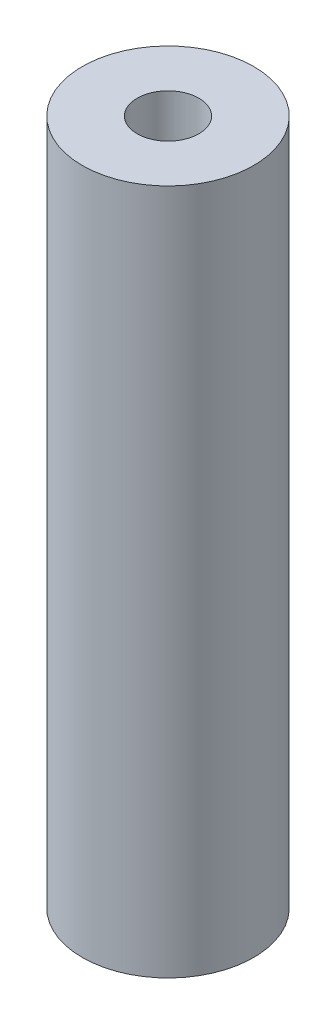
ISO-10303-21;
HEADER;
FILE_DESCRIPTION(('STEP AP214'),'2;1');
FILE_NAME('part.step','',(''),(''),'','','');
FILE_SCHEMA(('AUTOMOTIVE_DESIGN { 1 0 10303 214 1 1 1 1 }'));
ENDSEC;
DATA;
#1=APPLICATION_CONTEXT('core data for automotive mechanical design processes');
#2=APPLICATION_PROTOCOL_DEFINITION('international standard','automotive_design',2000,#1);
#3=PRODUCT_CONTEXT('',#1,'mechanical');
#4=PRODUCT('Part','Part','',(#3));
#5=PRODUCT_RELATED_PRODUCT_CATEGORY('part','',(#4));
#6=PRODUCT_DEFINITION_FORMATION('','',#4);
#7=PRODUCT_DEFINITION_CONTEXT('part definition',#1,'design');
#8=PRODUCT_DEFINITION('design','',#6,#7);
#9=PRODUCT_DEFINITION_SHAPE('','',#8);
#10=(LENGTH_UNIT() NAMED_UNIT(*) SI_UNIT(.MILLI.,.METRE.));
#11=(NAMED_UNIT(*) PLANE_ANGLE_UNIT() SI_UNIT($,.RADIAN.));
#12=(NAMED_UNIT(*) SI_UNIT($,.STERADIAN.) SOLID_ANGLE_UNIT());
#13=UNCERTAINTY_MEASURE_WITH_UNIT(LENGTH_MEASURE(1.E-05),#10,'distance_accuracy_value','');
#14=(GEOMETRIC_REPRESENTATION_CONTEXT(3) GLOBAL_UNCERTAINTY_ASSIGNED_CONTEXT((#13)) GLOBAL_UNIT_ASSIGNED_CONTEXT((#10,
#11,#12)) REPRESENTATION_CONTEXT('',''));
#15=CARTESIAN_POINT('',(0.,0.,0.));
#16=DIRECTION('',(0.,0.,1.));
#17=DIRECTION('',(1.,0.,0.));
#18=AXIS2_PLACEMENT_3D('',#15,#16,#17);
#19=CARTESIAN_POINT('',(0.,400.,0.));
#20=DIRECTION('',(0.,1.,0.));
#21=DIRECTION('',(0.,0.,1.));
#22=AXIS2_PLACEMENT_3D('',#19,#20,#21);
#23=PLANE('',#22);
#24=CARTESIAN_POINT('',(0.,400.,0.));
#25=DIRECTION('',(0.,1.,0.));
#26=DIRECTION('',(0.,0.,1.));
#27=AXIS2_PLACEMENT_3D('',#24,#25,#26);
#28=CIRCLE('',#27,50.);
#29=CARTESIAN_POINT('',(0.,400.,50.));
#30=VERTEX_POINT('',#29);
#31=EDGE_CURVE('E10',#30,#30,#28,.T.);
#32=ORIENTED_EDGE('',*,*,#31,.T.);
#33=EDGE_LOOP('',(#32));
#34=FACE_BOUND('',#33,.T.);
#35=CARTESIAN_POINT('',(0.,400.,0.));
#36=DIRECTION('',(0.,1.,0.));
#37=DIRECTION('',(0.,0.,1.));
#38=AXIS2_PLACEMENT_3D('',#35,#36,#37);
#39=CIRCLE('',#38,18.);
#40=CARTESIAN_POINT('',(0.,400.,18.));
#41=VERTEX_POINT('',#40);
#42=EDGE_CURVE('E50',#41,#41,#39,.T.);
#43=ORIENTED_EDGE('',*,*,#42,.F.);
#44=EDGE_LOOP('',(#43));
#45=FACE_BOUND('',#44,.T.);
#46=ADVANCED_FACE('F36',(#34,#45),#23,.T.);
#47=CARTESIAN_POINT('',(0.,0.,0.));
#48=DIRECTION('',(0.,1.,0.));
#49=DIRECTION('',(0.,0.,1.));
#50=AXIS2_PLACEMENT_3D('',#47,#48,#49);
#51=PLANE('',#50);
#52=CARTESIAN_POINT('',(0.,0.,0.));
#53=DIRECTION('',(0.,1.,0.));
#54=DIRECTION('',(0.,0.,1.));
#55=AXIS2_PLACEMENT_3D('',#52,#53,#54);
#56=CIRCLE('',#55,50.);
#57=CARTESIAN_POINT('',(0.,0.,50.));
#58=VERTEX_POINT('',#57);
#59=EDGE_CURVE('E40',#58,#58,#56,.T.);
#60=ORIENTED_EDGE('',*,*,#59,.F.);
#61=EDGE_LOOP('',(#60));
#62=FACE_BOUND('',#61,.T.);
#63=CARTESIAN_POINT('',(0.,0.,0.));
#64=DIRECTION('',(0.,1.,0.));
#65=DIRECTION('',(0.,0.,1.));
#66=AXIS2_PLACEMENT_3D('',#63,#64,#65);
#67=CIRCLE('',#66,18.);
#68=CARTESIAN_POINT('',(0.,0.,18.));
#69=VERTEX_POINT('',#68);
#70=EDGE_CURVE('E52',#69,#69,#67,.T.);
#71=ORIENTED_EDGE('',*,*,#70,.T.);
#72=EDGE_LOOP('',(#71));
#73=FACE_BOUND('',#72,.T.);
#74=ADVANCED_FACE('F63',(#62,#73),#51,.F.);
#75=CARTESIAN_POINT('',(0.,400.,0.));
#76=DIRECTION('',(0.,-1.,0.));
#77=DIRECTION('',(0.,0.,-1.));
#78=AXIS2_PLACEMENT_3D('',#75,#76,#77);
#79=CYLINDRICAL_SURFACE('',#78,50.);
#80=ORIENTED_EDGE('',*,*,#31,.F.);
#81=EDGE_LOOP('',(#80));
#82=FACE_BOUND('',#81,.T.);
#83=ORIENTED_EDGE('',*,*,#59,.T.);
#84=EDGE_LOOP('',(#83));
#85=FACE_BOUND('',#84,.T.);
#86=ADVANCED_FACE('F38',(#82,#85),#79,.T.);
#87=CARTESIAN_POINT('',(0.,400.,0.));
#88=DIRECTION('',(0.,-1.,0.));
#89=DIRECTION('',(0.,0.,-1.));
#90=AXIS2_PLACEMENT_3D('',#87,#88,#89);
#91=CYLINDRICAL_SURFACE('',#90,18.);
#92=ORIENTED_EDGE('',*,*,#42,.T.);
#93=EDGE_LOOP('',(#92));
#94=FACE_BOUND('',#93,.T.);
#95=ORIENTED_EDGE('',*,*,#70,.F.);
#96=EDGE_LOOP('',(#95));
#97=FACE_BOUND('',#96,.T.);
#98=ADVANCED_FACE('F59',(#94,#97),#91,.F.);
#99=CLOSED_SHELL('',(#46,#74,#86,#98));
#100=MANIFOLD_SOLID_BREP('B2',#99);
#101=ADVANCED_BREP_SHAPE_REPRESENTATION('',(#18,#100),#14);
#102=SHAPE_DEFINITION_REPRESENTATION(#9,#101);
ENDSEC;
END-ISO-10303-21;
